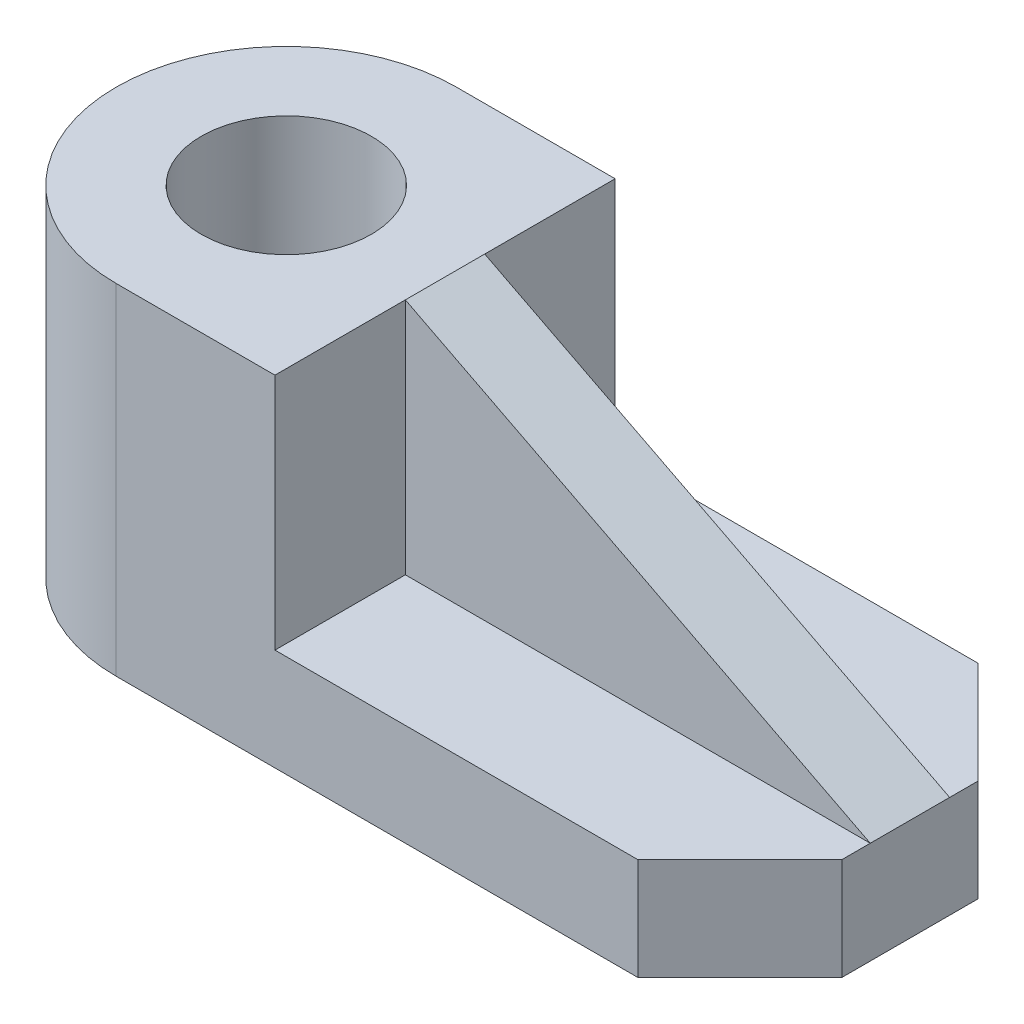
ISO-10303-21;
HEADER;
FILE_DESCRIPTION(('STEP AP214'),'2;1');
FILE_NAME('part.step','',(''),(''),'','','');
FILE_SCHEMA(('AUTOMOTIVE_DESIGN { 1 0 10303 214 1 1 1 1 }'));
ENDSEC;
DATA;
#1=APPLICATION_CONTEXT('core data for automotive mechanical design processes');
#2=APPLICATION_PROTOCOL_DEFINITION('international standard','automotive_design',2000,#1);
#3=PRODUCT_CONTEXT('',#1,'mechanical');
#4=PRODUCT('Part','Part','',(#3));
#5=PRODUCT_RELATED_PRODUCT_CATEGORY('part','',(#4));
#6=PRODUCT_DEFINITION_FORMATION('','',#4);
#7=PRODUCT_DEFINITION_CONTEXT('part definition',#1,'design');
#8=PRODUCT_DEFINITION('design','',#6,#7);
#9=PRODUCT_DEFINITION_SHAPE('','',#8);
#10=(LENGTH_UNIT() NAMED_UNIT(*) SI_UNIT(.MILLI.,.METRE.));
#11=(NAMED_UNIT(*) PLANE_ANGLE_UNIT() SI_UNIT($,.RADIAN.));
#12=(NAMED_UNIT(*) SI_UNIT($,.STERADIAN.) SOLID_ANGLE_UNIT());
#13=UNCERTAINTY_MEASURE_WITH_UNIT(LENGTH_MEASURE(1.E-05),#10,'distance_accuracy_value','');
#14=(GEOMETRIC_REPRESENTATION_CONTEXT(3) GLOBAL_UNCERTAINTY_ASSIGNED_CONTEXT((#13)) GLOBAL_UNIT_ASSIGNED_CONTEXT((#10,
#11,#12)) REPRESENTATION_CONTEXT('',''));
#15=CARTESIAN_POINT('',(0.,0.,0.));
#16=DIRECTION('',(0.,0.,1.));
#17=DIRECTION('',(1.,0.,0.));
#18=AXIS2_PLACEMENT_3D('',#15,#16,#17);
#19=CARTESIAN_POINT('',(14.,30.,0.));
#20=DIRECTION('',(-1.,0.,0.));
#21=DIRECTION('',(0.,0.,1.));
#22=AXIS2_PLACEMENT_3D('',#19,#20,#21);
#23=PLANE('',#22);
#24=DIRECTION('',(0.,1.,0.));
#25=VECTOR('',#24,1.);
#26=CARTESIAN_POINT('',(14.,9.,3.5));
#27=LINE('',#26,#25);
#28=CARTESIAN_POINT('',(14.,9.,3.5));
#29=VERTEX_POINT('',#28);
#30=CARTESIAN_POINT('',(14.,30.,3.5));
#31=VERTEX_POINT('',#30);
#32=EDGE_CURVE('E57',#29,#31,#27,.T.);
#33=ORIENTED_EDGE('',*,*,#32,.T.);
#34=DIRECTION('',(0.,0.,-1.));
#35=VECTOR('',#34,1.);
#36=CARTESIAN_POINT('',(14.,30.,0.));
#37=LINE('',#36,#35);
#38=CARTESIAN_POINT('',(14.,30.,15.));
#39=VERTEX_POINT('',#38);
#40=EDGE_CURVE('E187',#39,#31,#37,.T.);
#41=ORIENTED_EDGE('',*,*,#40,.F.);
#42=DIRECTION('',(0.,-1.,0.));
#43=VECTOR('',#42,1.);
#44=CARTESIAN_POINT('',(14.,30.,15.));
#45=LINE('',#44,#43);
#46=CARTESIAN_POINT('',(14.,9.,15.));
#47=VERTEX_POINT('',#46);
#48=EDGE_CURVE('E11',#39,#47,#45,.T.);
#49=ORIENTED_EDGE('',*,*,#48,.T.);
#50=DIRECTION('',(0.,0.,-1.));
#51=VECTOR('',#50,1.);
#52=CARTESIAN_POINT('',(14.,9.,0.));
#53=LINE('',#52,#51);
#54=EDGE_CURVE('E128',#47,#29,#53,.T.);
#55=ORIENTED_EDGE('',*,*,#54,.T.);
#56=EDGE_LOOP('',(#33,#41,#49,#55));
#57=FACE_BOUND('',#56,.T.);
#58=ADVANCED_FACE('F34',(#57),#23,.F.);
#59=CARTESIAN_POINT('',(0.,9.,0.));
#60=DIRECTION('',(0.,1.,0.));
#61=DIRECTION('',(0.,0.,1.));
#62=AXIS2_PLACEMENT_3D('',#59,#60,#61);
#63=PLANE('',#62);
#64=DIRECTION('',(0.,0.,-1.));
#65=VECTOR('',#64,1.);
#66=CARTESIAN_POINT('',(55.,9.,0.));
#67=LINE('',#66,#65);
#68=CARTESIAN_POINT('',(55.,9.,6.));
#69=VERTEX_POINT('',#68);
#70=CARTESIAN_POINT('',(55.,9.,3.5));
#71=VERTEX_POINT('',#70);
#72=EDGE_CURVE('E162',#69,#71,#67,.T.);
#73=ORIENTED_EDGE('',*,*,#72,.T.);
#74=DIRECTION('',(-1.,0.,0.));
#75=VECTOR('',#74,1.);
#76=CARTESIAN_POINT('',(55.,9.,3.5));
#77=LINE('',#76,#75);
#78=EDGE_CURVE('E145',#71,#29,#77,.T.);
#79=ORIENTED_EDGE('',*,*,#78,.T.);
#80=ORIENTED_EDGE('',*,*,#54,.F.);
#81=DIRECTION('',(1.,0.,0.));
#82=VECTOR('',#81,1.);
#83=CARTESIAN_POINT('',(0.,9.,15.));
#84=LINE('',#83,#82);
#85=CARTESIAN_POINT('',(46.,9.,15.));
#86=VERTEX_POINT('',#85);
#87=EDGE_CURVE('E157',#47,#86,#84,.T.);
#88=ORIENTED_EDGE('',*,*,#87,.T.);
#89=DIRECTION('',(0.707106781186548,0.,-0.707106781186547));
#90=VECTOR('',#89,1.);
#91=CARTESIAN_POINT('',(30.5,9.,30.5));
#92=LINE('',#91,#90);
#93=EDGE_CURVE('E159',#86,#69,#92,.T.);
#94=ORIENTED_EDGE('',*,*,#93,.T.);
#95=EDGE_LOOP('',(#73,#79,#80,#88,#94));
#96=FACE_BOUND('',#95,.T.);
#97=ADVANCED_FACE('F230',(#96),#63,.T.);
#98=CARTESIAN_POINT('',(0.,30.,15.));
#99=DIRECTION('',(0.,0.,1.));
#100=DIRECTION('',(1.,0.,0.));
#101=AXIS2_PLACEMENT_3D('',#98,#99,#100);
#102=PLANE('',#101);
#103=DIRECTION('',(-1.,0.,0.));
#104=VECTOR('',#103,1.);
#105=CARTESIAN_POINT('',(0.,0.,15.));
#106=LINE('',#105,#104);
#107=CARTESIAN_POINT('',(46.,0.,15.));
#108=VERTEX_POINT('',#107);
#109=CARTESIAN_POINT('',(0.,0.,15.));
#110=VERTEX_POINT('',#109);
#111=EDGE_CURVE('E182',#108,#110,#106,.T.);
#112=ORIENTED_EDGE('',*,*,#111,.F.);
#113=DIRECTION('',(0.,-1.,0.));
#114=VECTOR('',#113,1.);
#115=CARTESIAN_POINT('',(46.,9.,15.));
#116=LINE('',#115,#114);
#117=EDGE_CURVE('E176',#86,#108,#116,.T.);
#118=ORIENTED_EDGE('',*,*,#117,.F.);
#119=ORIENTED_EDGE('',*,*,#87,.F.);
#120=ORIENTED_EDGE('',*,*,#48,.F.);
#121=DIRECTION('',(-1.,0.,0.));
#122=VECTOR('',#121,1.);
#123=CARTESIAN_POINT('',(0.,30.,15.));
#124=LINE('',#123,#122);
#125=CARTESIAN_POINT('',(0.,30.,15.));
#126=VERTEX_POINT('',#125);
#127=EDGE_CURVE('E183',#39,#126,#124,.T.);
#128=ORIENTED_EDGE('',*,*,#127,.T.);
#129=DIRECTION('',(0.,-1.,0.));
#130=VECTOR('',#129,1.);
#131=CARTESIAN_POINT('',(0.,30.,15.));
#132=LINE('',#131,#130);
#133=EDGE_CURVE('E196',#126,#110,#132,.T.);
#134=ORIENTED_EDGE('',*,*,#133,.T.);
#135=EDGE_LOOP('',(#112,#118,#119,#120,#128,#134));
#136=FACE_BOUND('',#135,.T.);
#137=ADVANCED_FACE('F36',(#136),#102,.T.);
#138=CARTESIAN_POINT('',(14.,30.,-3.5));
#139=VERTEX_POINT('',#138);
#140=CARTESIAN_POINT('',(14.,30.,-15.));
#141=VERTEX_POINT('',#140);
#142=EDGE_CURVE('E49',#139,#141,#37,.T.);
#143=ORIENTED_EDGE('',*,*,#142,.F.);
#144=DIRECTION('',(0.,1.,0.));
#145=VECTOR('',#144,1.);
#146=CARTESIAN_POINT('',(14.,9.,-3.5));
#147=LINE('',#146,#145);
#148=CARTESIAN_POINT('',(14.,9.,-3.5));
#149=VERTEX_POINT('',#148);
#150=EDGE_CURVE('E131',#149,#139,#147,.T.);
#151=ORIENTED_EDGE('',*,*,#150,.F.);
#152=CARTESIAN_POINT('',(14.,9.,-15.));
#153=VERTEX_POINT('',#152);
#154=EDGE_CURVE('E119',#149,#153,#53,.T.);
#155=ORIENTED_EDGE('',*,*,#154,.T.);
#156=DIRECTION('',(0.,-1.,0.));
#157=VECTOR('',#156,1.);
#158=CARTESIAN_POINT('',(14.,30.,-15.));
#159=LINE('',#158,#157);
#160=EDGE_CURVE('E42',#141,#153,#159,.T.);
#161=ORIENTED_EDGE('',*,*,#160,.F.);
#162=EDGE_LOOP('',(#143,#151,#155,#161));
#163=FACE_BOUND('',#162,.T.);
#164=ADVANCED_FACE('F132',(#163),#23,.F.);
#165=CARTESIAN_POINT('',(0.,30.,-15.));
#166=DIRECTION('',(0.,0.,1.));
#167=DIRECTION('',(1.,0.,0.));
#168=AXIS2_PLACEMENT_3D('',#165,#166,#167);
#169=PLANE('',#168);
#170=DIRECTION('',(-1.,0.,0.));
#171=VECTOR('',#170,1.);
#172=CARTESIAN_POINT('',(0.,0.,-15.));
#173=LINE('',#172,#171);
#174=CARTESIAN_POINT('',(46.,0.,-15.));
#175=VERTEX_POINT('',#174);
#176=CARTESIAN_POINT('',(0.,0.,-15.));
#177=VERTEX_POINT('',#176);
#178=EDGE_CURVE('E199',#175,#177,#173,.T.);
#179=ORIENTED_EDGE('',*,*,#178,.T.);
#180=DIRECTION('',(0.,-1.,0.));
#181=VECTOR('',#180,1.);
#182=CARTESIAN_POINT('',(0.,30.,-15.));
#183=LINE('',#182,#181);
#184=CARTESIAN_POINT('',(0.,30.,-15.));
#185=VERTEX_POINT('',#184);
#186=EDGE_CURVE('E207',#185,#177,#183,.T.);
#187=ORIENTED_EDGE('',*,*,#186,.F.);
#188=DIRECTION('',(-1.,0.,0.));
#189=VECTOR('',#188,1.);
#190=CARTESIAN_POINT('',(0.,30.,-15.));
#191=LINE('',#190,#189);
#192=EDGE_CURVE('E189',#141,#185,#191,.T.);
#193=ORIENTED_EDGE('',*,*,#192,.F.);
#194=ORIENTED_EDGE('',*,*,#160,.T.);
#195=DIRECTION('',(1.,0.,0.));
#196=VECTOR('',#195,1.);
#197=CARTESIAN_POINT('',(0.,9.,-15.));
#198=LINE('',#197,#196);
#199=CARTESIAN_POINT('',(46.,9.,-15.));
#200=VERTEX_POINT('',#199);
#201=EDGE_CURVE('E126',#153,#200,#198,.T.);
#202=ORIENTED_EDGE('',*,*,#201,.T.);
#203=DIRECTION('',(0.,-1.,0.));
#204=VECTOR('',#203,1.);
#205=CARTESIAN_POINT('',(46.,9.,-15.));
#206=LINE('',#205,#204);
#207=EDGE_CURVE('E179',#200,#175,#206,.T.);
#208=ORIENTED_EDGE('',*,*,#207,.T.);
#209=EDGE_LOOP('',(#179,#187,#193,#194,#202,#208));
#210=FACE_BOUND('',#209,.T.);
#211=ADVANCED_FACE('F211',(#210),#169,.F.);
#212=CARTESIAN_POINT('',(0.,30.,0.));
#213=DIRECTION('',(0.,-1.,0.));
#214=DIRECTION('',(0.,0.,-1.));
#215=AXIS2_PLACEMENT_3D('',#212,#213,#214);
#216=CYLINDRICAL_SURFACE('',#215,15.);
#217=CARTESIAN_POINT('',(0.,0.,0.));
#218=DIRECTION('',(0.,1.,0.));
#219=DIRECTION('',(0.,0.,1.));
#220=AXIS2_PLACEMENT_3D('',#217,#218,#219);
#221=CIRCLE('',#220,15.);
#222=EDGE_CURVE('E201',#177,#110,#221,.T.);
#223=ORIENTED_EDGE('',*,*,#222,.T.);
#224=ORIENTED_EDGE('',*,*,#133,.F.);
#225=CARTESIAN_POINT('',(0.,30.,0.));
#226=DIRECTION('',(0.,1.,0.));
#227=DIRECTION('',(0.,0.,1.));
#228=AXIS2_PLACEMENT_3D('',#225,#226,#227);
#229=CIRCLE('',#228,15.);
#230=EDGE_CURVE('E191',#185,#126,#229,.T.);
#231=ORIENTED_EDGE('',*,*,#230,.F.);
#232=ORIENTED_EDGE('',*,*,#186,.T.);
#233=EDGE_LOOP('',(#223,#224,#231,#232));
#234=FACE_BOUND('',#233,.T.);
#235=ADVANCED_FACE('F249',(#234),#216,.T.);
#236=CARTESIAN_POINT('',(0.,30.,0.));
#237=DIRECTION('',(0.,-1.,0.));
#238=DIRECTION('',(0.,0.,-1.));
#239=AXIS2_PLACEMENT_3D('',#236,#237,#238);
#240=CYLINDRICAL_SURFACE('',#239,7.5);
#241=CARTESIAN_POINT('',(0.,30.,0.));
#242=DIRECTION('',(0.,1.,0.));
#243=DIRECTION('',(0.,0.,1.));
#244=AXIS2_PLACEMENT_3D('',#241,#242,#243);
#245=CIRCLE('',#244,7.5);
#246=CARTESIAN_POINT('',(0.,30.,7.5));
#247=VERTEX_POINT('',#246);
#248=EDGE_CURVE('E193',#247,#247,#245,.T.);
#249=ORIENTED_EDGE('',*,*,#248,.T.);
#250=EDGE_LOOP('',(#249));
#251=FACE_BOUND('',#250,.T.);
#252=CARTESIAN_POINT('',(0.,0.,0.));
#253=DIRECTION('',(0.,1.,0.));
#254=DIRECTION('',(0.,0.,1.));
#255=AXIS2_PLACEMENT_3D('',#252,#253,#254);
#256=CIRCLE('',#255,7.5);
#257=CARTESIAN_POINT('',(0.,0.,7.5));
#258=VERTEX_POINT('',#257);
#259=EDGE_CURVE('E186',#258,#258,#256,.T.);
#260=ORIENTED_EDGE('',*,*,#259,.F.);
#261=EDGE_LOOP('',(#260));
#262=FACE_BOUND('',#261,.T.);
#263=ADVANCED_FACE('F256',(#251,#262),#240,.F.);
#264=CARTESIAN_POINT('',(0.,30.,0.));
#265=DIRECTION('',(0.,1.,0.));
#266=DIRECTION('',(0.,0.,1.));
#267=AXIS2_PLACEMENT_3D('',#264,#265,#266);
#268=PLANE('',#267);
#269=ORIENTED_EDGE('',*,*,#127,.F.);
#270=ORIENTED_EDGE('',*,*,#40,.T.);
#271=DIRECTION('',(0.,0.,-1.));
#272=VECTOR('',#271,1.);
#273=CARTESIAN_POINT('',(14.,30.,3.5));
#274=LINE('',#273,#272);
#275=EDGE_CURVE('E150',#31,#139,#274,.T.);
#276=ORIENTED_EDGE('',*,*,#275,.T.);
#277=ORIENTED_EDGE('',*,*,#142,.T.);
#278=ORIENTED_EDGE('',*,*,#192,.T.);
#279=ORIENTED_EDGE('',*,*,#230,.T.);
#280=EDGE_LOOP('',(#269,#270,#276,#277,#278,#279));
#281=FACE_BOUND('',#280,.T.);
#282=ORIENTED_EDGE('',*,*,#248,.F.);
#283=EDGE_LOOP('',(#282));
#284=FACE_BOUND('',#283,.T.);
#285=ADVANCED_FACE('F216',(#281,#284),#268,.T.);
#286=CARTESIAN_POINT('',(0.,0.,0.));
#287=DIRECTION('',(0.,1.,0.));
#288=DIRECTION('',(0.,0.,1.));
#289=AXIS2_PLACEMENT_3D('',#286,#287,#288);
#290=PLANE('',#289);
#291=ORIENTED_EDGE('',*,*,#111,.T.);
#292=ORIENTED_EDGE('',*,*,#222,.F.);
#293=ORIENTED_EDGE('',*,*,#178,.F.);
#294=DIRECTION('',(0.707106781186548,0.,0.707106781186548));
#295=VECTOR('',#294,1.);
#296=CARTESIAN_POINT('',(30.5,0.,-30.5));
#297=LINE('',#296,#295);
#298=CARTESIAN_POINT('',(55.,0.,-6.));
#299=VERTEX_POINT('',#298);
#300=EDGE_CURVE('E149',#175,#299,#297,.T.);
#301=ORIENTED_EDGE('',*,*,#300,.T.);
#302=DIRECTION('',(0.,0.,-1.));
#303=VECTOR('',#302,1.);
#304=CARTESIAN_POINT('',(55.,0.,0.));
#305=LINE('',#304,#303);
#306=CARTESIAN_POINT('',(55.,0.,6.));
#307=VERTEX_POINT('',#306);
#308=EDGE_CURVE('E155',#307,#299,#305,.T.);
#309=ORIENTED_EDGE('',*,*,#308,.F.);
#310=DIRECTION('',(0.707106781186548,0.,-0.707106781186547));
#311=VECTOR('',#310,1.);
#312=CARTESIAN_POINT('',(30.5,0.,30.5));
#313=LINE('',#312,#311);
#314=EDGE_CURVE('E168',#108,#307,#313,.T.);
#315=ORIENTED_EDGE('',*,*,#314,.F.);
#316=EDGE_LOOP('',(#291,#292,#293,#301,#309,#315));
#317=FACE_BOUND('',#316,.T.);
#318=ORIENTED_EDGE('',*,*,#259,.T.);
#319=EDGE_LOOP('',(#318));
#320=FACE_BOUND('',#319,.T.);
#321=ADVANCED_FACE('F250',(#317,#320),#290,.F.);
#322=CARTESIAN_POINT('',(30.5,9.,-30.5));
#323=DIRECTION('',(0.707106781186547,0.,-0.707106781186547));
#324=DIRECTION('',(-0.707106781186548,0.,-0.707106781186548));
#325=AXIS2_PLACEMENT_3D('',#322,#323,#324);
#326=PLANE('',#325);
#327=ORIENTED_EDGE('',*,*,#300,.F.);
#328=ORIENTED_EDGE('',*,*,#207,.F.);
#329=DIRECTION('',(0.707106781186548,0.,0.707106781186548));
#330=VECTOR('',#329,1.);
#331=CARTESIAN_POINT('',(30.5,9.,-30.5));
#332=LINE('',#331,#330);
#333=CARTESIAN_POINT('',(55.,9.,-6.));
#334=VERTEX_POINT('',#333);
#335=EDGE_CURVE('E152',#200,#334,#332,.T.);
#336=ORIENTED_EDGE('',*,*,#335,.T.);
#337=DIRECTION('',(0.,-1.,0.));
#338=VECTOR('',#337,1.);
#339=CARTESIAN_POINT('',(55.,9.,-6.));
#340=LINE('',#339,#338);
#341=EDGE_CURVE('E165',#334,#299,#340,.T.);
#342=ORIENTED_EDGE('',*,*,#341,.T.);
#343=EDGE_LOOP('',(#327,#328,#336,#342));
#344=FACE_BOUND('',#343,.T.);
#345=ADVANCED_FACE('F245',(#344),#326,.T.);
#346=CARTESIAN_POINT('',(30.5,9.,30.5));
#347=DIRECTION('',(-0.707106781186547,0.,-0.707106781186548));
#348=DIRECTION('',(-0.707106781186548,0.,0.707106781186547));
#349=AXIS2_PLACEMENT_3D('',#346,#347,#348);
#350=PLANE('',#349);
#351=ORIENTED_EDGE('',*,*,#314,.T.);
#352=DIRECTION('',(0.,-1.,0.));
#353=VECTOR('',#352,1.);
#354=CARTESIAN_POINT('',(55.,9.,6.));
#355=LINE('',#354,#353);
#356=EDGE_CURVE('E173',#69,#307,#355,.T.);
#357=ORIENTED_EDGE('',*,*,#356,.F.);
#358=ORIENTED_EDGE('',*,*,#93,.F.);
#359=ORIENTED_EDGE('',*,*,#117,.T.);
#360=EDGE_LOOP('',(#351,#357,#358,#359));
#361=FACE_BOUND('',#360,.T.);
#362=ADVANCED_FACE('F237',(#361),#350,.F.);
#363=CARTESIAN_POINT('',(55.,9.,0.));
#364=DIRECTION('',(-1.,0.,0.));
#365=DIRECTION('',(0.,0.,1.));
#366=AXIS2_PLACEMENT_3D('',#363,#364,#365);
#367=PLANE('',#366);
#368=ORIENTED_EDGE('',*,*,#308,.T.);
#369=ORIENTED_EDGE('',*,*,#341,.F.);
#370=CARTESIAN_POINT('',(55.,9.,-3.5));
#371=VERTEX_POINT('',#370);
#372=EDGE_CURVE('E161',#371,#334,#67,.T.);
#373=ORIENTED_EDGE('',*,*,#372,.F.);
#374=DIRECTION('',(0.,0.,-1.));
#375=VECTOR('',#374,1.);
#376=CARTESIAN_POINT('',(55.,9.,3.5));
#377=LINE('',#376,#375);
#378=EDGE_CURVE('E146',#71,#371,#377,.T.);
#379=ORIENTED_EDGE('',*,*,#378,.F.);
#380=ORIENTED_EDGE('',*,*,#72,.F.);
#381=ORIENTED_EDGE('',*,*,#356,.T.);
#382=EDGE_LOOP('',(#368,#369,#373,#379,#380,#381));
#383=FACE_BOUND('',#382,.T.);
#384=ADVANCED_FACE('F241',(#383),#367,.F.);
#385=DIRECTION('',(-1.,0.,0.));
#386=VECTOR('',#385,1.);
#387=CARTESIAN_POINT('',(55.,9.,-3.5));
#388=LINE('',#387,#386);
#389=EDGE_CURVE('E122',#371,#149,#388,.T.);
#390=ORIENTED_EDGE('',*,*,#389,.F.);
#391=ORIENTED_EDGE('',*,*,#372,.T.);
#392=ORIENTED_EDGE('',*,*,#335,.F.);
#393=ORIENTED_EDGE('',*,*,#201,.F.);
#394=ORIENTED_EDGE('',*,*,#154,.F.);
#395=EDGE_LOOP('',(#390,#391,#392,#393,#394));
#396=FACE_BOUND('',#395,.T.);
#397=ADVANCED_FACE('F120',(#396),#63,.T.);
#398=CARTESIAN_POINT('',(14.,30.,3.5));
#399=DIRECTION('',(0.455875869805658,0.890043364858665,0.));
#400=DIRECTION('',(-0.890043364858665,0.455875869805658,0.));
#401=AXIS2_PLACEMENT_3D('',#398,#399,#400);
#402=PLANE('',#401);
#403=DIRECTION('',(0.890043364858665,-0.455875869805658,0.));
#404=VECTOR('',#403,1.);
#405=CARTESIAN_POINT('',(14.,30.,-3.5));
#406=LINE('',#405,#404);
#407=EDGE_CURVE('E136',#139,#371,#406,.T.);
#408=ORIENTED_EDGE('',*,*,#407,.F.);
#409=ORIENTED_EDGE('',*,*,#275,.F.);
#410=DIRECTION('',(0.890043364858665,-0.455875869805658,0.));
#411=VECTOR('',#410,1.);
#412=CARTESIAN_POINT('',(14.,30.,3.5));
#413=LINE('',#412,#411);
#414=EDGE_CURVE('E141',#31,#71,#413,.T.);
#415=ORIENTED_EDGE('',*,*,#414,.T.);
#416=ORIENTED_EDGE('',*,*,#378,.T.);
#417=EDGE_LOOP('',(#408,#409,#415,#416));
#418=FACE_BOUND('',#417,.T.);
#419=ADVANCED_FACE('F223',(#418),#402,.T.);
#420=CARTESIAN_POINT('',(0.,0.,3.5));
#421=DIRECTION('',(0.,0.,-1.));
#422=DIRECTION('',(-1.,0.,0.));
#423=AXIS2_PLACEMENT_3D('',#420,#421,#422);
#424=PLANE('',#423);
#425=ORIENTED_EDGE('',*,*,#78,.F.);
#426=ORIENTED_EDGE('',*,*,#414,.F.);
#427=ORIENTED_EDGE('',*,*,#32,.F.);
#428=EDGE_LOOP('',(#425,#426,#427));
#429=FACE_BOUND('',#428,.T.);
#430=ADVANCED_FACE('F226',(#429),#424,.F.);
#431=CARTESIAN_POINT('',(0.,0.,-3.5));
#432=DIRECTION('',(0.,0.,-1.));
#433=DIRECTION('',(-1.,0.,0.));
#434=AXIS2_PLACEMENT_3D('',#431,#432,#433);
#435=PLANE('',#434);
#436=ORIENTED_EDGE('',*,*,#389,.T.);
#437=ORIENTED_EDGE('',*,*,#150,.T.);
#438=ORIENTED_EDGE('',*,*,#407,.T.);
#439=EDGE_LOOP('',(#436,#437,#438));
#440=FACE_BOUND('',#439,.T.);
#441=ADVANCED_FACE('F138',(#440),#435,.T.);
#442=CLOSED_SHELL('',(#58,#97,#137,#164,#211,#235,#263,#285,#321,#345,#362,#384,#397,#419,#430,#441));
#443=MANIFOLD_SOLID_BREP('B2',#442);
#444=ADVANCED_BREP_SHAPE_REPRESENTATION('',(#18,#443),#14);
#445=SHAPE_DEFINITION_REPRESENTATION(#9,#444);
ENDSEC;
END-ISO-10303-21;
